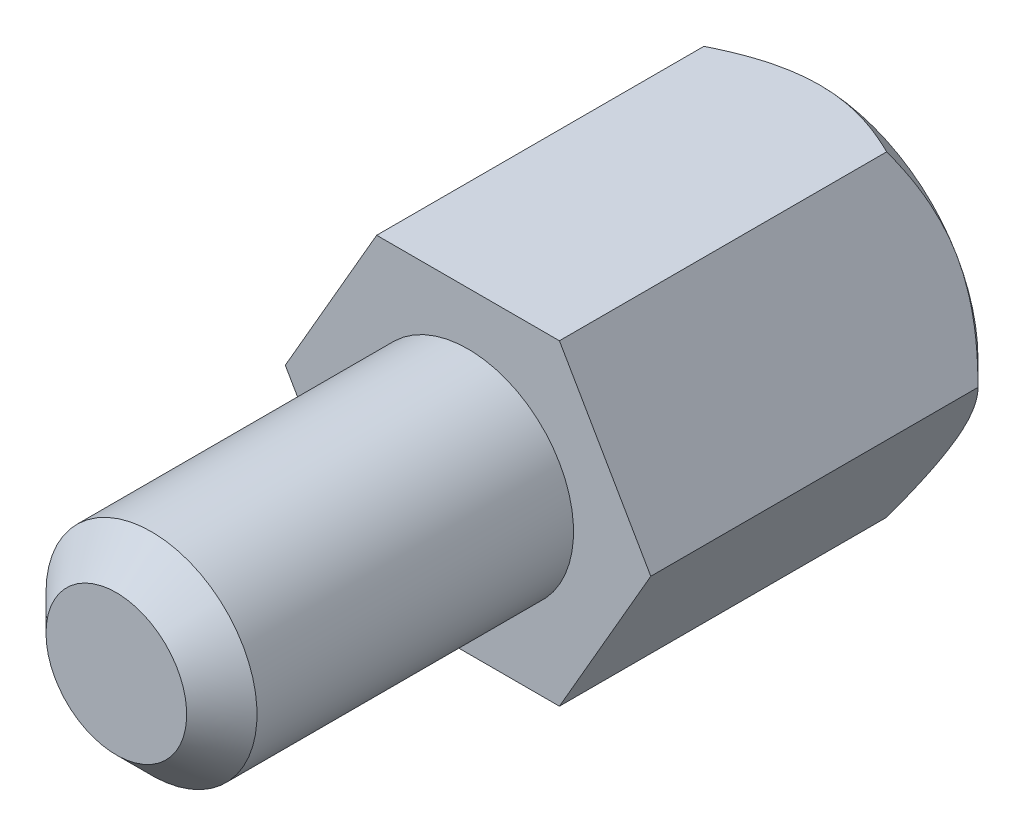
ISO-10303-21;
HEADER;
FILE_DESCRIPTION(('STEP AP214'),'2;1');
FILE_NAME('part.step','',(''),(''),'','','');
FILE_SCHEMA(('AUTOMOTIVE_DESIGN { 1 0 10303 214 1 1 1 1 }'));
ENDSEC;
DATA;
#1=APPLICATION_CONTEXT('core data for automotive mechanical design processes');
#2=APPLICATION_PROTOCOL_DEFINITION('international standard','automotive_design',2000,#1);
#3=PRODUCT_CONTEXT('',#1,'mechanical');
#4=PRODUCT('Part','Part','',(#3));
#5=PRODUCT_RELATED_PRODUCT_CATEGORY('part','',(#4));
#6=PRODUCT_DEFINITION_FORMATION('','',#4);
#7=PRODUCT_DEFINITION_CONTEXT('part definition',#1,'design');
#8=PRODUCT_DEFINITION('design','',#6,#7);
#9=PRODUCT_DEFINITION_SHAPE('','',#8);
#10=(LENGTH_UNIT() NAMED_UNIT(*) SI_UNIT(.MILLI.,.METRE.));
#11=(NAMED_UNIT(*) PLANE_ANGLE_UNIT() SI_UNIT($,.RADIAN.));
#12=(NAMED_UNIT(*) SI_UNIT($,.STERADIAN.) SOLID_ANGLE_UNIT());
#13=UNCERTAINTY_MEASURE_WITH_UNIT(LENGTH_MEASURE(1.E-05),#10,'distance_accuracy_value','');
#14=(GEOMETRIC_REPRESENTATION_CONTEXT(3) GLOBAL_UNCERTAINTY_ASSIGNED_CONTEXT((#13)) GLOBAL_UNIT_ASSIGNED_CONTEXT((#10,
#11,#12)) REPRESENTATION_CONTEXT('',''));
#15=CARTESIAN_POINT('',(0.,0.,0.));
#16=DIRECTION('',(0.,0.,1.));
#17=DIRECTION('',(1.,0.,0.));
#18=AXIS2_PLACEMENT_3D('',#15,#16,#17);
#19=CARTESIAN_POINT('',(0.,0.,-1.));
#20=DIRECTION('',(0.,0.,-1.));
#21=DIRECTION('',(-1.,0.,0.));
#22=AXIS2_PLACEMENT_3D('',#19,#20,#21);
#23=PLANE('',#22);
#24=CARTESIAN_POINT('',(0.,0.,-1.));
#25=DIRECTION('',(0.,0.,-1.));
#26=DIRECTION('',(-1.,0.,0.));
#27=AXIS2_PLACEMENT_3D('',#24,#25,#26);
#28=CIRCLE('',#27,1.2);
#29=CARTESIAN_POINT('',(-1.2,0.,-1.));
#30=VERTEX_POINT('',#29);
#31=EDGE_CURVE('E20',#30,#30,#28,.T.);
#32=ORIENTED_EDGE('',*,*,#31,.T.);
#33=EDGE_LOOP('',(#32));
#34=FACE_BOUND('',#33,.T.);
#35=ADVANCED_FACE('F17',(#34),#23,.T.);
#36=CARTESIAN_POINT('',(0.,0.,-1.));
#37=DIRECTION('',(0.,0.,-1.));
#38=DIRECTION('',(-1.,0.,0.));
#39=AXIS2_PLACEMENT_3D('',#36,#37,#38);
#40=CYLINDRICAL_SURFACE('',#39,1.2);
#41=CARTESIAN_POINT('',(0.,0.,-4.50000000006412));
#42=DIRECTION('',(0.,0.,-1.));
#43=DIRECTION('',(-1.,0.,0.));
#44=AXIS2_PLACEMENT_3D('',#41,#42,#43);
#45=CIRCLE('',#44,1.19999999998299);
#46=CARTESIAN_POINT('',(-1.19999999998299,0.,-4.50000000006412));
#47=VERTEX_POINT('',#46);
#48=EDGE_CURVE('E98',#47,#47,#45,.T.);
#49=ORIENTED_EDGE('',*,*,#48,.T.);
#50=EDGE_LOOP('',(#49));
#51=FACE_BOUND('',#50,.T.);
#52=ORIENTED_EDGE('',*,*,#31,.F.);
#53=EDGE_LOOP('',(#52));
#54=FACE_BOUND('',#53,.T.);
#55=ADVANCED_FACE('F139',(#51,#54),#40,.F.);
#56=CARTESIAN_POINT('',(0.,0.,-4.99999999999545));
#57=DIRECTION('',(0.,0.,-1.));
#58=DIRECTION('',(-1.,0.,0.));
#59=AXIS2_PLACEMENT_3D('',#56,#57,#58);
#60=CONICAL_SURFACE('',#59,1.69999999991433,0.785398163340605);
#61=CARTESIAN_POINT('',(0.,0.,-5.0000000000523));
#62=DIRECTION('',(0.,0.,-1.));
#63=DIRECTION('',(-1.,0.,0.));
#64=AXIS2_PLACEMENT_3D('',#61,#62,#63);
#65=CIRCLE('',#64,1.69999999997117);
#66=CARTESIAN_POINT('',(-1.69999999997117,0.,-5.0000000000523));
#67=VERTEX_POINT('',#66);
#68=EDGE_CURVE('E210',#67,#67,#65,.T.);
#69=ORIENTED_EDGE('',*,*,#68,.T.);
#70=EDGE_LOOP('',(#69));
#71=FACE_BOUND('',#70,.T.);
#72=ORIENTED_EDGE('',*,*,#48,.F.);
#73=EDGE_LOOP('',(#72));
#74=FACE_BOUND('',#73,.T.);
#75=ADVANCED_FACE('F134',(#71,#74),#60,.F.);
#76=CARTESIAN_POINT('',(0.,0.,-4.64983533146324));
#77=DIRECTION('',(0.,0.,1.));
#78=DIRECTION('',(1.,0.,0.));
#79=AXIS2_PLACEMENT_3D('',#76,#77,#78);
#80=CONICAL_SURFACE('',#79,2.60016466853585,0.785398163478615);
#81=CARTESIAN_POINT('',(0.,0.,-4.99999999993861));
#82=DIRECTION('',(0.,0.,1.));
#83=DIRECTION('',(1.,0.,0.));
#84=AXIS2_PLACEMENT_3D('',#81,#82,#83);
#85=CIRCLE('',#84,2.25000000000364);
#86=CARTESIAN_POINT('',(1.94855715851657,1.12500000000091,-4.99999999994043));
#87=VERTEX_POINT('',#86);
#88=CARTESIAN_POINT('',(0.,2.25000000000182,-4.99999999994043));
#89=VERTEX_POINT('',#88);
#90=EDGE_CURVE('E107',#87,#89,#85,.T.);
#91=ORIENTED_EDGE('',*,*,#90,.T.);
#92=CARTESIAN_POINT('',(0.,2.25,-4.99999999994225));
#93=CARTESIAN_POINT('',(0.0691231952969481,2.25,-5.00005769566472));
#94=CARTESIAN_POINT('',(0.138210834061678,2.25,-4.99681595840725));
#95=CARTESIAN_POINT('',(0.275703192085911,2.25,-4.9841880738306));
#96=CARTESIAN_POINT('',(0.344108913998066,2.25,-4.97481295788263));
#97=CARTESIAN_POINT('',(0.478853281082809,2.25,-4.95055410759525));
#98=CARTESIAN_POINT('',(0.545207541880582,2.25,-4.93575558561657));
#99=CARTESIAN_POINT('',(0.676649632414394,2.25,-4.90131240170121));
#100=CARTESIAN_POINT('',(0.741737058618174,2.25,-4.88166622201075));
#101=CARTESIAN_POINT('',(0.890255506277357,2.25,-4.83157588954895));
#102=CARTESIAN_POINT('',(0.973191975157517,2.25,-4.7996679034908));
#103=CARTESIAN_POINT('',(1.09619890484288,2.25,-4.74745032324661));
#104=CARTESIAN_POINT('',(1.13717470612179,2.25,-4.72921361446463));
#105=CARTESIAN_POINT('',(1.21853808880119,2.25,-4.69147710460049));
#106=CARTESIAN_POINT('',(1.25892570915799,2.25,-4.67197738764001));
#107=CARTESIAN_POINT('',(1.29903811794718,2.25,-4.65192378251017));
#108=B_SPLINE_CURVE_WITH_KNOTS('',3,(#92,#93,#94,#95,#96,#97,#98,#99,#100,#101,#102,#103,#104,
#105,#106,#107),.UNSPECIFIED.,.F.,.F.,(4,2,2,2,2,2,2,4),(0.,0.207236750061439,0.414101789224245,
0.617846930899487,0.821655944289508,1.08795515504436,1.22249175677334,1.35701940699246),.UNSPECIFIED.);
#109=CARTESIAN_POINT('',(1.29903812335872,2.24999996937378,-4.65192380632749));
#110=VERTEX_POINT('',#109);
#111=EDGE_CURVE('E97',#89,#110,#108,.T.);
#112=ORIENTED_EDGE('',*,*,#111,.T.);
#113=CARTESIAN_POINT('',(1.29903814104078,2.24999993874756,-4.65192382400954));
#114=CARTESIAN_POINT('',(1.34397176096636,2.17217262606846,-4.69681511428304));
#115=CARTESIAN_POINT('',(1.38966481639771,2.09302993250831,-4.73905431559381));
#116=CARTESIAN_POINT('',(1.48287268880467,1.93158916183404,-4.81634968521076));
#117=CARTESIAN_POINT('',(1.530397249423,1.84927420823571,-4.85135842660177));
#118=CARTESIAN_POINT('',(1.62559553404947,1.68438594246927,-4.91081128891958));
#119=CARTESIAN_POINT('',(1.67322478044966,1.60188966777792,-4.93553288038567));
#120=CARTESIAN_POINT('',(1.76950500984404,1.43512741870246,-4.97362178793472));
#121=CARTESIAN_POINT('',(1.8181523999549,1.35086766737483,-4.98702379044215));
#122=CARTESIAN_POINT('',(1.88054136312167,1.24280681333844,-4.99605556502801));
#123=CARTESIAN_POINT('',(1.8941010871739,1.21932068234337,-4.99752952614255));
#124=CARTESIAN_POINT('',(1.9212920183797,1.17222460798982,-4.99950329210802));
#125=CARTESIAN_POINT('',(1.93492329593189,1.14861454269735,-4.99999921519013));
#126=CARTESIAN_POINT('',(1.94855715851499,1.125,-4.99999999994224));
#127=B_SPLINE_CURVE_WITH_KNOTS('',3,(#113,#114,#115,#116,#117,#118,#119,#120,#121,#122,#123,
#124,#125,#126),.UNSPECIFIED.,.F.,.F.,(4,2,2,2,2,2,4),(0.,0.301589252505211,0.605097951221235,
0.899785727268252,1.19356718620256,1.27503294851359,1.35682139754623),.UNSPECIFIED.);
#128=EDGE_CURVE('E85',#110,#87,#127,.T.);
#129=ORIENTED_EDGE('',*,*,#128,.T.);
#130=EDGE_LOOP('',(#91,#112,#129));
#131=FACE_BOUND('',#130,.T.);
#132=ADVANCED_FACE('F106',(#131),#80,.T.);
#133=CARTESIAN_POINT('',(0.,0.,-4.64983533146324));
#134=DIRECTION('',(0.,0.,1.));
#135=DIRECTION('',(1.,0.,0.));
#136=AXIS2_PLACEMENT_3D('',#133,#134,#135);
#137=CONICAL_SURFACE('',#136,2.60016466853585,0.785398163478615);
#138=CARTESIAN_POINT('',(-1.94855715851498,1.125,-4.99999999994225));
#139=CARTESIAN_POINT('',(-1.91399556087554,1.18486244310227,-5.00005769566468));
#140=CARTESIAN_POINT('',(-1.8794517415021,1.24469409334456,-4.99681595840892));
#141=CARTESIAN_POINT('',(-1.81070556250572,1.3637659681925,-4.9841880738384));
#142=CARTESIAN_POINT('',(-1.77650270155648,1.42300706112081,-4.97481295789452));
#143=CARTESIAN_POINT('',(-1.70913051801204,1.53969910603662,-4.95055410761177));
#144=CARTESIAN_POINT('',(-1.6759533876045,1.59716358155183,-4.93575558563104));
#145=CARTESIAN_POINT('',(-1.61023234232141,1.71099577110868,-4.9013124017095));
#146=CARTESIAN_POINT('',(-1.57768862921196,1.76736313568119,-4.88166622201515));
#147=CARTESIAN_POINT('',(-1.50342941262247,1.89598387174444,-4.83157589443633));
#148=CARTESIAN_POINT('',(-1.46196118522524,1.96780894849627,-4.79966791448344));
#149=CARTESIAN_POINT('',(-1.40045773071639,2.0743360565466,-4.74745034472723));
#150=CARTESIAN_POINT('',(-1.3799698335219,2.1098221354277,-4.72921363970782));
#151=CARTESIAN_POINT('',(-1.33928814897233,2.18028488000504,-4.69147713772548));
#152=CARTESIAN_POINT('',(-1.31909434213916,2.21526157943832,-4.67197742488395));
#153=CARTESIAN_POINT('',(-1.2990381410479,2.24999993873521,-4.65192382401668));
#154=B_SPLINE_CURVE_WITH_KNOTS('',3,(#138,#139,#140,#141,#142,#143,#144,#145,#146,#147,#148,
#149,#150,#151,#152,#153),.UNSPECIFIED.,.F.,.F.,(4,2,2,2,2,2,2,4),(0.,0.207236750007737,
0.414101789128227,0.617846930856227,0.821655944289529,1.08795510917792,1.22249168743843,
1.35701931421665),.UNSPECIFIED.);
#155=CARTESIAN_POINT('',(-1.94855715851656,1.12500000000091,-4.99999999994043));
#156=VERTEX_POINT('',#155);
#157=CARTESIAN_POINT('',(-1.29903811275409,2.25,-4.65192378510672));
#158=VERTEX_POINT('',#157);
#159=EDGE_CURVE('E109',#156,#158,#154,.T.);
#160=ORIENTED_EDGE('',*,*,#159,.T.);
#161=CARTESIAN_POINT('',(-1.29903811311482,2.24999996936861,-4.65192376813459));
#162=CARTESIAN_POINT('',(-1.20917087313892,2.24999998898255,-4.69681507139159));
#163=CARTESIAN_POINT('',(-1.11778475968825,2.24999999704264,-4.73905428051075));
#164=CARTESIAN_POINT('',(-0.931369007384038,2.25000000297619,-4.81634966086851));
#165=CARTESIAN_POINT('',(-0.836319881233159,2.25000000078449,-4.85135840516906));
#166=CARTESIAN_POINT('',(-0.645923302935002,2.24999999923831,-4.91081127374393));
#167=CARTESIAN_POINT('',(-0.550664806013649,2.24999999980322,-4.93553286858432));
#168=CARTESIAN_POINT('',(-0.358104338417895,2.25000000019618,-4.97362178173023));
#169=CARTESIAN_POINT('',(-0.260809553511088,2.25000000002649,-4.98702378646013));
#170=CARTESIAN_POINT('',(-0.136031617176851,2.24999999999266,-4.99605556349461));
#171=CARTESIAN_POINT('',(-0.108912163840652,2.24999999999632,-4.9975295251809));
#172=CARTESIAN_POINT('',(-0.0545302908898665,2.2500000000037,-4.99950329191626));
#173=CARTESIAN_POINT('',(-0.0272677304779138,2.25000000000741,-4.99999921519376));
#174=CARTESIAN_POINT('',(0.,2.25,-4.99999999994225));
#175=B_SPLINE_CURVE_WITH_KNOTS('',3,(#161,#162,#163,#164,#165,#166,#167,#168,#169,#170,#171,
#172,#173,#174),.UNSPECIFIED.,.F.,.F.,(4,2,2,2,2,2,4),(0.,0.301589269313151,0.605097984614075,
0.899785775270863,1.19356724886461,1.27503302693426,1.35682149189123),.UNSPECIFIED.);
#176=EDGE_CURVE('E112',#158,#89,#175,.T.);
#177=ORIENTED_EDGE('',*,*,#176,.T.);
#178=CARTESIAN_POINT('',(0.,0.,-4.99999999993861));
#179=DIRECTION('',(0.,0.,1.));
#180=DIRECTION('',(1.,0.,0.));
#181=AXIS2_PLACEMENT_3D('',#178,#179,#180);
#182=CIRCLE('',#181,2.25000000000364);
#183=EDGE_CURVE('E283',#89,#156,#182,.T.);
#184=ORIENTED_EDGE('',*,*,#183,.T.);
#185=EDGE_LOOP('',(#160,#177,#184));
#186=FACE_BOUND('',#185,.T.);
#187=ADVANCED_FACE('F133',(#186),#137,.T.);
#188=CARTESIAN_POINT('',(0.,0.,-4.64983533146324));
#189=DIRECTION('',(0.,0.,1.));
#190=DIRECTION('',(1.,0.,0.));
#191=AXIS2_PLACEMENT_3D('',#188,#189,#190);
#192=CONICAL_SURFACE('',#191,2.60016466853585,0.785398163478615);
#193=CARTESIAN_POINT('',(-1.94855715851498,-1.125,-4.99999999994225));
#194=CARTESIAN_POINT('',(-1.98311875615442,-1.06513755689773,-5.00005769566469));
#195=CARTESIAN_POINT('',(-2.01766257552787,-1.00530590665544,-4.99681595840892));
#196=CARTESIAN_POINT('',(-2.08640875452424,-0.886234031807498,-4.98418807383841));
#197=CARTESIAN_POINT('',(-2.12061161547349,-0.826992938879196,-4.97481295789453));
#198=CARTESIAN_POINT('',(-2.18798379901792,-0.710300893963381,-4.95055410761178));
#199=CARTESIAN_POINT('',(-2.22116092942547,-0.652836418448172,-4.93575558563105));
#200=CARTESIAN_POINT('',(-2.28688197470856,-0.539004228891321,-4.90131240170951));
#201=CARTESIAN_POINT('',(-2.319425687818,-0.482636864318816,-4.88166622201516));
#202=CARTESIAN_POINT('',(-2.39368490440745,-0.354016128255625,-4.83157589443636));
#203=CARTESIAN_POINT('',(-2.43515313180466,-0.282191051503849,-4.79966791448349));
#204=CARTESIAN_POINT('',(-2.49665658631346,-0.175663943453599,-4.74745034472733));
#205=CARTESIAN_POINT('',(-2.51714448350794,-0.140177864572523,-4.72921363970795));
#206=CARTESIAN_POINT('',(-2.55782616805747,-0.0697151199952434,-4.69147713772564));
#207=CARTESIAN_POINT('',(-2.57801997489062,-0.034738420561985,-4.67197742488413));
#208=CARTESIAN_POINT('',(-2.59807617598187,-6.12651227535217E-08,-4.65192382401688));
#209=B_SPLINE_CURVE_WITH_KNOTS('',3,(#193,#194,#195,#196,#197,#198,#199,#200,#201,#202,#203,
#204,#205,#206,#207,#208),.UNSPECIFIED.,.F.,.F.,(4,2,2,2,2,2,2,4),(0.,0.207236750007735,
0.414101789128224,0.617846930856223,0.821655944289525,1.0879551091777,1.2224916874381,
1.35701931421622),.UNSPECIFIED.);
#210=CARTESIAN_POINT('',(-1.94855715851656,-1.12500000000091,-4.99999999994043));
#211=VERTEX_POINT('',#210);
#212=CARTESIAN_POINT('',(-2.59807621489213,-6.12940751478169E-09,-4.65192378510662));
#213=VERTEX_POINT('',#212);
#214=EDGE_CURVE('E179',#211,#213,#209,.T.);
#215=ORIENTED_EDGE('',*,*,#214,.T.);
#216=CARTESIAN_POINT('',(-2.59807618854488,-2.17577171721221E-08,-4.65192376813433));
#217=CARTESIAN_POINT('',(-2.55314258554319,0.0778273008364195,-4.6968150713914));
#218=CARTESIAN_POINT('',(-2.50744953579812,0.156970000667897,-4.73905428051059));
#219=CARTESIAN_POINT('',(-2.41424166478463,0.318410780795755,-4.81634966086841));
#220=CARTESIAN_POINT('',(-2.3667170998111,0.400725737554094,-4.85135840516896));
#221=CARTESIAN_POINT('',(-2.27151880932296,0.565614010380873,-4.91081127374386));
#222=CARTESIAN_POINT('',(-2.22388956135151,0.648110288923558,-4.93553286858427));
#223=CARTESIAN_POINT('',(-2.12760932789392,0.814872545822607,-4.97362178173021));
#224=CARTESIAN_POINT('',(-2.07896193529356,0.89913230112282,-4.98702378646011));
#225=CARTESIAN_POINT('',(-2.01657296709711,1.00719316380319,-4.99605556349461));
#226=CARTESIAN_POINT('',(-2.00301324043217,1.03067929933094,-4.9975295251809));
#227=CARTESIAN_POINT('',(-1.97582230396314,1.07777538281543,-4.99950329191626));
#228=CARTESIAN_POINT('',(-1.96219102376037,1.10138545270626,-4.99999921519377));
#229=CARTESIAN_POINT('',(-1.94855715851498,1.125,-4.99999999994225));
#230=B_SPLINE_CURVE_WITH_KNOTS('',3,(#216,#217,#218,#219,#220,#221,#222,#223,#224,#225,#226,
#227,#228,#229),.UNSPECIFIED.,.F.,.F.,(4,2,2,2,2,2,4),(0.,0.301589269313229,0.605097984614229,
0.899785775271084,1.1935672488649,1.27503302693462,1.35682149189166),.UNSPECIFIED.);
#231=EDGE_CURVE('E171',#213,#156,#230,.T.);
#232=ORIENTED_EDGE('',*,*,#231,.T.);
#233=CARTESIAN_POINT('',(0.,0.,-4.99999999993861));
#234=DIRECTION('',(0.,0.,1.));
#235=DIRECTION('',(1.,0.,0.));
#236=AXIS2_PLACEMENT_3D('',#233,#234,#235);
#237=CIRCLE('',#236,2.25000000000364);
#238=EDGE_CURVE('E278',#156,#211,#237,.T.);
#239=ORIENTED_EDGE('',*,*,#238,.T.);
#240=EDGE_LOOP('',(#215,#232,#239));
#241=FACE_BOUND('',#240,.T.);
#242=ADVANCED_FACE('F190',(#241),#192,.T.);
#243=CARTESIAN_POINT('',(0.,0.,-4.64983533146324));
#244=DIRECTION('',(0.,0.,1.));
#245=DIRECTION('',(1.,0.,0.));
#246=AXIS2_PLACEMENT_3D('',#243,#244,#245);
#247=CONICAL_SURFACE('',#246,2.60016466853585,0.785398163478615);
#248=CARTESIAN_POINT('',(0.,0.,-4.99999999993861));
#249=DIRECTION('',(0.,0.,1.));
#250=DIRECTION('',(1.,0.,0.));
#251=AXIS2_PLACEMENT_3D('',#248,#249,#250);
#252=CIRCLE('',#251,2.25000000000364);
#253=CARTESIAN_POINT('',(0.,-2.25000000000182,-4.99999999994043));
#254=VERTEX_POINT('',#253);
#255=CARTESIAN_POINT('',(1.94855715851656,-1.12500000000091,-4.99999999994043));
#256=VERTEX_POINT('',#255);
#257=EDGE_CURVE('E282',#254,#256,#252,.T.);
#258=ORIENTED_EDGE('',*,*,#257,.T.);
#259=CARTESIAN_POINT('',(1.94855715851499,-1.125,-4.99999999994225));
#260=CARTESIAN_POINT('',(1.91399556086651,-1.18486244311791,-5.00005769566472));
#261=CARTESIAN_POINT('',(1.87945174148415,-1.24469409337565,-4.99681595840725));
#262=CARTESIAN_POINT('',(1.81070556247203,-1.36376596825087,-4.9841880738306));
#263=CARTESIAN_POINT('',(1.77650270151595,-1.42300706119101,-4.97481295788263));
#264=CARTESIAN_POINT('',(1.70913051797358,-1.53969910610325,-4.95055410759525));
#265=CARTESIAN_POINT('',(1.67595338757469,-1.59716358160346,-4.93575558561657));
#266=CARTESIAN_POINT('',(1.61023234230779,-1.71099577113227,-4.90131240170121));
#267=CARTESIAN_POINT('',(1.5776886292059,-1.76736313569168,-4.88166622201075));
#268=CARTESIAN_POINT('',(1.503429405375,-1.89598388429743,-4.83157588954807));
#269=CARTESIAN_POINT('',(1.46196117093365,-1.96780897325004,-4.79966790348882));
#270=CARTESIAN_POINT('',(1.4004577060891,-2.07433609920232,-4.74745032324273));
#271=CARTESIAN_POINT('',(1.37996980544901,-2.10982218405137,-4.72921361446007));
#272=CARTESIAN_POINT('',(1.33928811410809,-2.18028494039168,-4.69147710459451));
#273=CARTESIAN_POINT('',(1.31909430392908,-2.21526164562012,-4.67197738763328));
#274=CARTESIAN_POINT('',(1.29903809953389,-2.25000001063958,-4.65192378250267));
#275=B_SPLINE_CURVE_WITH_KNOTS('',3,(#259,#260,#261,#262,#263,#264,#265,#266,#267,#268,#269,
#270,#271,#272,#273,#274),.UNSPECIFIED.,.F.,.F.,(4,2,2,2,2,2,2,4),(0.,0.207236750061449,
0.414101789224262,0.617846930899494,0.821655944289507,1.08795515505265,1.22249175678588,
1.35701940700924),.UNSPECIFIED.);
#276=CARTESIAN_POINT('',(1.29903807030487,-2.25,-4.65192380633133));
#277=VERTEX_POINT('',#276);
#278=EDGE_CURVE('E203',#256,#277,#275,.T.);
#279=ORIENTED_EDGE('',*,*,#278,.T.);
#280=CARTESIAN_POINT('',(1.29903803493308,-2.25,-4.65192382401723));
#281=CARTESIAN_POINT('',(1.20917079508285,-2.25,-4.69681511428986));
#282=CARTESIAN_POINT('',(1.11778468422112,-2.25,-4.73905431559979));
#283=CARTESIAN_POINT('',(0.931368939409197,-2.25,-4.81634968521512));
#284=CARTESIAN_POINT('',(0.836319818173591,-2.25,-4.85135842660536));
#285=CARTESIAN_POINT('',(0.645923248922773,-2.25,-4.91081128892184));
#286=CARTESIAN_POINT('',(0.550664756123445,-2.25,-4.93553288038735));
#287=CARTESIAN_POINT('',(0.358104297336863,-2.25,-4.97362178793548));
#288=CARTESIAN_POINT('',(0.260809517116269,-2.25,-4.98702379044256));
#289=CARTESIAN_POINT('',(0.136031590784321,-2.25,-4.99605556502816));
#290=CARTESIAN_POINT('',(0.108912142680328,-2.25,-4.99752952614264));
#291=CARTESIAN_POINT('',(0.0545302802696619,-2.25,-4.99950329210805));
#292=CARTESIAN_POINT('',(0.0272677251657489,-2.25,-4.99999921519013));
#293=CARTESIAN_POINT('',(0.,-2.25,-4.99999999994225));
#294=B_SPLINE_CURVE_WITH_KNOTS('',3,(#280,#281,#282,#283,#284,#285,#286,#287,#288,#289,#290,
#291,#292,#293),.UNSPECIFIED.,.F.,.F.,(4,2,2,2,2,2,4),(0.,0.301589252501537,0.605097951213804,
0.899785727257333,1.19356718618819,1.27503294849784,1.35682139752908),.UNSPECIFIED.);
#295=EDGE_CURVE('E178',#277,#254,#294,.T.);
#296=ORIENTED_EDGE('',*,*,#295,.T.);
#297=EDGE_LOOP('',(#258,#279,#296));
#298=FACE_BOUND('',#297,.T.);
#299=ADVANCED_FACE('F193',(#298),#247,.T.);
#300=CARTESIAN_POINT('',(-1.29903810567665,-2.25,-5.));
#301=DIRECTION('',(0.,0.,1.));
#302=DIRECTION('',(1.,0.,0.));
#303=AXIS2_PLACEMENT_3D('',#300,#301,#302);
#304=PLANE('',#303);
#305=CARTESIAN_POINT('',(0.,0.,-4.99999999993861));
#306=DIRECTION('',(0.,0.,1.));
#307=DIRECTION('',(1.,0.,0.));
#308=AXIS2_PLACEMENT_3D('',#305,#306,#307);
#309=CIRCLE('',#308,2.25000000000364);
#310=EDGE_CURVE('E290',#256,#87,#309,.T.);
#311=ORIENTED_EDGE('',*,*,#310,.F.);
#312=ORIENTED_EDGE('',*,*,#257,.F.);
#313=CARTESIAN_POINT('',(0.,0.,-4.99999999993861));
#314=DIRECTION('',(0.,0.,1.));
#315=DIRECTION('',(1.,0.,0.));
#316=AXIS2_PLACEMENT_3D('',#313,#314,#315);
#317=CIRCLE('',#316,2.25000000000364);
#318=EDGE_CURVE('E258',#211,#254,#317,.T.);
#319=ORIENTED_EDGE('',*,*,#318,.F.);
#320=ORIENTED_EDGE('',*,*,#238,.F.);
#321=ORIENTED_EDGE('',*,*,#183,.F.);
#322=ORIENTED_EDGE('',*,*,#90,.F.);
#323=EDGE_LOOP('',(#311,#312,#319,#320,#321,#322));
#324=FACE_BOUND('',#323,.T.);
#325=ORIENTED_EDGE('',*,*,#68,.F.);
#326=EDGE_LOOP('',(#325));
#327=FACE_BOUND('',#326,.T.);
#328=ADVANCED_FACE('F199',(#324,#327),#304,.F.);
#329=CARTESIAN_POINT('',(0.,0.,-4.64983533146324));
#330=DIRECTION('',(0.,0.,1.));
#331=DIRECTION('',(1.,0.,0.));
#332=AXIS2_PLACEMENT_3D('',#329,#330,#331);
#333=CONICAL_SURFACE('',#332,2.60016466853585,0.785398163478615);
#334=CARTESIAN_POINT('',(0.,-2.25,-4.99999999994225));
#335=CARTESIAN_POINT('',(-0.0691231952942782,-2.25,-5.00005769566472));
#336=CARTESIAN_POINT('',(-0.13821083405637,-2.25,-4.9968159584075));
#337=CARTESIAN_POINT('',(-0.275703192075949,-2.25,-4.98418807383176));
#338=CARTESIAN_POINT('',(-0.344108913986084,-2.25,-4.97481295788439));
#339=CARTESIAN_POINT('',(-0.478853281071437,-2.25,-4.95055410759769));
#340=CARTESIAN_POINT('',(-0.545207541871771,-2.25,-4.93575558561871));
#341=CARTESIAN_POINT('',(-0.676649632410368,-2.25,-4.90131240170244));
#342=CARTESIAN_POINT('',(-0.741737058616381,-2.25,-4.8816662220114));
#343=CARTESIAN_POINT('',(-0.890255504135093,-2.25,-4.83157589027141));
#344=CARTESIAN_POINT('',(-0.973191970933099,-2.25,-4.79966790511574));
#345=CARTESIAN_POINT('',(-1.09619889756336,-2.25,-4.74745032642189));
#346=CARTESIAN_POINT('',(-1.1371746978238,-2.25,-4.7292136181961));
#347=CARTESIAN_POINT('',(-1.21853807849575,-2.25,-4.69147710949705));
#348=CARTESIAN_POINT('',(-1.25892569786357,-2.25,-4.67197739314543));
#349=CARTESIAN_POINT('',(-1.29903810567615,-2.25,-4.65192378864569));
#350=B_SPLINE_CURVE_WITH_KNOTS('',3,(#334,#335,#336,#337,#338,#339,#340,#341,#342,#343,#344,
#345,#346,#347,#348,#349),.UNSPECIFIED.,.F.,.F.,(4,2,2,2,2,2,2,4),(0.,0.207236750053501,
0.414101789210051,0.617846930893092,0.82165594428951,1.08795514826436,1.22249174652422,
1.3570193932783),.UNSPECIFIED.);
#351=CARTESIAN_POINT('',(-1.29903810567653,-2.24999999999978,-4.65192378864569));
#352=VERTEX_POINT('',#351);
#353=EDGE_CURVE('E235',#254,#352,#350,.T.);
#354=ORIENTED_EDGE('',*,*,#353,.T.);
#355=CARTESIAN_POINT('',(-1.2990381056769,-2.24999999999957,-4.65192378864569));
#356=CARTESIAN_POINT('',(-1.34397172775764,-2.17217268358763,-4.69681508289023));
#357=CARTESIAN_POINT('',(-1.38966478540272,-2.09302998619318,-4.73905428810587));
#358=CARTESIAN_POINT('',(-1.48287266245123,-1.93158920747953,-4.81634966516579));
#359=CARTESIAN_POINT('',(-1.53039722549975,-1.84927424967197,-4.85135841008544));
#360=CARTESIAN_POINT('',(-1.62559551499861,-1.68438597546631,-4.91081127854707));
#361=CARTESIAN_POINT('',(-1.67322476383148,-1.60188969656144,-4.93553287267273));
#362=CARTESIAN_POINT('',(-1.76950499824655,-1.43512743878989,-4.97362178447698));
#363=CARTESIAN_POINT('',(-1.81815239094441,-1.35086768298144,-4.98702378858758));
#364=CARTESIAN_POINT('',(-1.88054135779069,-1.24280682257195,-4.99605556441006));
#365=CARTESIAN_POINT('',(-1.89410108290061,-1.2193206897449,-4.99752952575491));
#366=CARTESIAN_POINT('',(-1.9212920162358,-1.17222461170314,-4.99950329202985));
#367=CARTESIAN_POINT('',(-1.9349232948597,-1.14861454455441,-4.99999921519009));
#368=CARTESIAN_POINT('',(-1.94855715851498,-1.125,-4.99999999994225));
#369=B_SPLINE_CURVE_WITH_KNOTS('',3,(#355,#356,#357,#358,#359,#360,#361,#362,#363,#364,#365,
#366,#367,#368),.UNSPECIFIED.,.F.,.F.,(4,2,2,2,2,2,4),(0.,0.301589269436366,0.605097985463799,
0.899785777578431,1.19356725241796,1.27503302110004,1.35682147656287),.UNSPECIFIED.);
#370=EDGE_CURVE('E252',#352,#211,#369,.T.);
#371=ORIENTED_EDGE('',*,*,#370,.T.);
#372=ORIENTED_EDGE('',*,*,#318,.T.);
#373=EDGE_LOOP('',(#354,#371,#372));
#374=FACE_BOUND('',#373,.T.);
#375=ADVANCED_FACE('F245',(#374),#333,.T.);
#376=CARTESIAN_POINT('',(0.,0.,-4.64983533146324));
#377=DIRECTION('',(0.,0.,1.));
#378=DIRECTION('',(1.,0.,0.));
#379=AXIS2_PLACEMENT_3D('',#376,#377,#378);
#380=CONICAL_SURFACE('',#379,2.60016466853585,0.785398163478615);
#381=ORIENTED_EDGE('',*,*,#310,.T.);
#382=CARTESIAN_POINT('',(1.94855715851499,1.125,-4.99999999994224));
#383=CARTESIAN_POINT('',(1.98311875616213,1.0651375568844,-5.00005769566471));
#384=CARTESIAN_POINT('',(2.01766257554318,1.00530590662895,-4.99681595840749));
#385=CARTESIAN_POINT('',(2.08640875455296,0.886234031757776,-4.98418807383175));
#386=CARTESIAN_POINT('',(2.12061161550803,0.826992938819387,-4.97481295788438));
#387=CARTESIAN_POINT('',(2.18798379905071,0.710300893906615,-4.95055410759769));
#388=CARTESIAN_POINT('',(2.22116092945088,0.652836418404186,-4.93575558561871));
#389=CARTESIAN_POINT('',(2.28688197472018,0.539004228871222,-4.90131240170243));
#390=CARTESIAN_POINT('',(2.31942568782318,0.482636864309867,-4.8816662220114));
#391=CARTESIAN_POINT('',(2.39368491058139,0.354016117562086,-4.83157589027218));
#392=CARTESIAN_POINT('',(2.43515314397927,0.282191030416833,-4.79966790511748));
#393=CARTESIAN_POINT('',(2.49665660729275,0.175663907116434,-4.7474503264253));
#394=CARTESIAN_POINT('',(2.51714450742242,0.140177823151446,-4.72921361820011));
#395=CARTESIAN_POINT('',(2.55782619775731,0.0697150685536259,-4.69147710950232));
#396=CARTESIAN_POINT('',(2.57802000744069,0.0347383641836473,-4.67197739315136));
#397=CARTESIAN_POINT('',(2.59807621134645,1.1896807412358E-11,-4.6519237886523));
#398=B_SPLINE_CURVE_WITH_KNOTS('',3,(#382,#383,#384,#385,#386,#387,#388,#389,#390,#391,#392,
#393,#394,#395,#396,#397),.UNSPECIFIED.,.F.,.F.,(4,2,2,2,2,2,2,4),(0.,0.207236750053493,
0.414101789210038,0.617846930893087,0.821655944289513,1.08795514825705,1.22249174651317,
1.35701939326351),.UNSPECIFIED.);
#399=CARTESIAN_POINT('',(2.59807621138696,-5.7650610644841E-12,-4.65192378861196));
#400=VERTEX_POINT('',#399);
#401=EDGE_CURVE('E91',#87,#400,#398,.T.);
#402=ORIENTED_EDGE('',*,*,#401,.T.);
#403=CARTESIAN_POINT('',(2.59807621134001,-9.41665583510788E-12,-4.65192378864911));
#404=CARTESIAN_POINT('',(2.553142589264,-0.0778273164218923,-4.69681508289476));
#405=CARTESIAN_POINT('',(2.50744953162118,-0.156970013816018,-4.73905428811038));
#406=CARTESIAN_POINT('',(2.41424165457506,-0.318410792528162,-4.81634966516935));
#407=CARTESIAN_POINT('',(2.36671709152665,-0.400725750334542,-4.85135841008807));
#408=CARTESIAN_POINT('',(2.27151880202868,-0.565614024537989,-4.91081127854834));
#409=CARTESIAN_POINT('',(2.22388955319655,-0.648110303441829,-4.93553287267356));
#410=CARTESIAN_POINT('',(2.12760931878283,-0.814872561211215,-4.97362178447714));
#411=CARTESIAN_POINT('',(2.07896192608557,-0.899132317018547,-4.98702378858752));
#412=CARTESIAN_POINT('',(2.01657295923983,-1.00719317742709,-4.99605556440999));
#413=CARTESIAN_POINT('',(2.00301323412979,-1.03067931025434,-4.99752952575486));
#414=CARTESIAN_POINT('',(1.97582230079439,-1.07777538829648,-4.99950329202983));
#415=CARTESIAN_POINT('',(1.96219102217038,-1.1013854554454,-4.99999921519009));
#416=CARTESIAN_POINT('',(1.94855715851499,-1.125,-4.99999999994225));
#417=B_SPLINE_CURVE_WITH_KNOTS('',3,(#403,#404,#405,#406,#407,#408,#409,#410,#411,#412,#413,
#414,#415,#416),.UNSPECIFIED.,.F.,.F.,(4,2,2,2,2,2,4),(0.,0.301589269432515,0.605097985455878,
0.899785777566556,1.19356725240221,1.27503302108495,1.35682147654843),.UNSPECIFIED.);
#418=EDGE_CURVE('E221',#400,#256,#417,.T.);
#419=ORIENTED_EDGE('',*,*,#418,.T.);
#420=EDGE_LOOP('',(#381,#402,#419));
#421=FACE_BOUND('',#420,.T.);
#422=ADVANCED_FACE('F240',(#421),#380,.T.);
#423=CARTESIAN_POINT('',(0.,0.,5.));
#424=DIRECTION('',(0.,0.,1.));
#425=DIRECTION('',(1.,0.,0.));
#426=AXIS2_PLACEMENT_3D('',#423,#424,#425);
#427=PLANE('',#426);
#428=CARTESIAN_POINT('',(0.,0.,4.99999999999545));
#429=DIRECTION('',(0.,0.,-1.));
#430=DIRECTION('',(-1.,0.,0.));
#431=AXIS2_PLACEMENT_3D('',#428,#429,#430);
#432=CIRCLE('',#431,0.99999999991951);
#433=CARTESIAN_POINT('',(-0.99999999991951,0.,4.99999999999545));
#434=VERTEX_POINT('',#433);
#435=EDGE_CURVE('E312',#434,#434,#432,.T.);
#436=ORIENTED_EDGE('',*,*,#435,.F.);
#437=EDGE_LOOP('',(#436));
#438=FACE_BOUND('',#437,.T.);
#439=ADVANCED_FACE('F244',(#438),#427,.T.);
#440=CARTESIAN_POINT('',(-1.29903810567665,-2.25,-5.));
#441=DIRECTION('',(0.866025403784439,0.5,0.));
#442=DIRECTION('',(-0.5,0.866025403784439,0.));
#443=AXIS2_PLACEMENT_3D('',#440,#441,#442);
#444=PLANE('',#443);
#445=ORIENTED_EDGE('',*,*,#214,.F.);
#446=ORIENTED_EDGE('',*,*,#370,.F.);
#447=DIRECTION('',(0.,0.,1.));
#448=VECTOR('',#447,1.);
#449=CARTESIAN_POINT('',(-1.29903810567665,-2.25,-5.00000000000001));
#450=LINE('',#449,#448);
#451=CARTESIAN_POINT('',(-1.29903810567666,-2.25,0.));
#452=VERTEX_POINT('',#451);
#453=EDGE_CURVE('E230',#352,#452,#450,.T.);
#454=ORIENTED_EDGE('',*,*,#453,.T.);
#455=DIRECTION('',(0.499999999999998,-0.86602540378444,0.));
#456=VECTOR('',#455,1.);
#457=CARTESIAN_POINT('',(-2.59807621135331,0.,0.));
#458=LINE('',#457,#456);
#459=CARTESIAN_POINT('',(-2.59807621135331,0.,0.));
#460=VERTEX_POINT('',#459);
#461=EDGE_CURVE('E308',#460,#452,#458,.T.);
#462=ORIENTED_EDGE('',*,*,#461,.F.);
#463=DIRECTION('',(0.,0.,1.));
#464=VECTOR('',#463,1.);
#465=CARTESIAN_POINT('',(-2.59807621135331,0.,-5.));
#466=LINE('',#465,#464);
#467=EDGE_CURVE('E103',#460,#213,#466,.F.);
#468=ORIENTED_EDGE('',*,*,#467,.T.);
#469=EDGE_LOOP('',(#445,#446,#454,#462,#468));
#470=FACE_BOUND('',#469,.T.);
#471=ADVANCED_FACE('F260',(#470),#444,.F.);
#472=CARTESIAN_POINT('',(1.29903810567666,-2.25,-5.00000000000001));
#473=DIRECTION('',(0.,1.,0.));
#474=DIRECTION('',(-1.,0.,0.));
#475=AXIS2_PLACEMENT_3D('',#472,#473,#474);
#476=PLANE('',#475);
#477=ORIENTED_EDGE('',*,*,#353,.F.);
#478=ORIENTED_EDGE('',*,*,#295,.F.);
#479=DIRECTION('',(0.,0.,1.));
#480=VECTOR('',#479,1.);
#481=CARTESIAN_POINT('',(1.29903810567666,-2.25,-5.00000000000001));
#482=LINE('',#481,#480);
#483=CARTESIAN_POINT('',(1.29903810567666,-2.25,0.));
#484=VERTEX_POINT('',#483);
#485=EDGE_CURVE('E229',#277,#484,#482,.T.);
#486=ORIENTED_EDGE('',*,*,#485,.T.);
#487=DIRECTION('',(1.,0.,0.));
#488=VECTOR('',#487,1.);
#489=CARTESIAN_POINT('',(-1.29903810567666,-2.25,0.));
#490=LINE('',#489,#488);
#491=EDGE_CURVE('E311',#452,#484,#490,.T.);
#492=ORIENTED_EDGE('',*,*,#491,.F.);
#493=ORIENTED_EDGE('',*,*,#453,.F.);
#494=EDGE_LOOP('',(#477,#478,#486,#492,#493));
#495=FACE_BOUND('',#494,.T.);
#496=ADVANCED_FACE('F215',(#495),#476,.F.);
#497=CARTESIAN_POINT('',(2.59807621135331,0.,-5.00000000000001));
#498=DIRECTION('',(-0.866025403784439,0.5,0.));
#499=DIRECTION('',(-0.5,-0.866025403784439,0.));
#500=AXIS2_PLACEMENT_3D('',#497,#498,#499);
#501=PLANE('',#500);
#502=ORIENTED_EDGE('',*,*,#278,.F.);
#503=ORIENTED_EDGE('',*,*,#418,.F.);
#504=DIRECTION('',(0.,0.,1.));
#505=VECTOR('',#504,1.);
#506=CARTESIAN_POINT('',(2.59807621135332,0.,-5.00000000000001));
#507=LINE('',#506,#505);
#508=CARTESIAN_POINT('',(2.59807621135332,0.,0.));
#509=VERTEX_POINT('',#508);
#510=EDGE_CURVE('E104',#400,#509,#507,.T.);
#511=ORIENTED_EDGE('',*,*,#510,.T.);
#512=DIRECTION('',(0.499999999999998,0.86602540378444,0.));
#513=VECTOR('',#512,1.);
#514=CARTESIAN_POINT('',(1.29903810567666,-2.25,0.));
#515=LINE('',#514,#513);
#516=EDGE_CURVE('E316',#484,#509,#515,.T.);
#517=ORIENTED_EDGE('',*,*,#516,.F.);
#518=ORIENTED_EDGE('',*,*,#485,.F.);
#519=EDGE_LOOP('',(#502,#503,#511,#517,#518));
#520=FACE_BOUND('',#519,.T.);
#521=ADVANCED_FACE('F212',(#520),#501,.F.);
#522=CARTESIAN_POINT('',(1.29903810567666,2.25,-5.00000000000001));
#523=DIRECTION('',(-0.866025403784439,-0.5,0.));
#524=DIRECTION('',(0.5,-0.866025403784439,0.));
#525=AXIS2_PLACEMENT_3D('',#522,#523,#524);
#526=PLANE('',#525);
#527=ORIENTED_EDGE('',*,*,#401,.F.);
#528=ORIENTED_EDGE('',*,*,#128,.F.);
#529=DIRECTION('',(0.,0.,-1.));
#530=VECTOR('',#529,1.);
#531=CARTESIAN_POINT('',(1.29903810567666,2.25,-5.));
#532=LINE('',#531,#530);
#533=CARTESIAN_POINT('',(1.29903810567666,2.25,0.));
#534=VERTEX_POINT('',#533);
#535=EDGE_CURVE('E89',#110,#534,#532,.F.);
#536=ORIENTED_EDGE('',*,*,#535,.T.);
#537=DIRECTION('',(-0.499999999999998,0.86602540378444,0.));
#538=VECTOR('',#537,1.);
#539=CARTESIAN_POINT('',(2.59807621135331,0.,0.));
#540=LINE('',#539,#538);
#541=EDGE_CURVE('E305',#509,#534,#540,.T.);
#542=ORIENTED_EDGE('',*,*,#541,.F.);
#543=ORIENTED_EDGE('',*,*,#510,.F.);
#544=EDGE_LOOP('',(#527,#528,#536,#542,#543));
#545=FACE_BOUND('',#544,.T.);
#546=ADVANCED_FACE('F87',(#545),#526,.F.);
#547=CARTESIAN_POINT('',(-1.29903810567665,2.25,-5.));
#548=DIRECTION('',(0.,-1.,0.));
#549=DIRECTION('',(0.,0.,-1.));
#550=AXIS2_PLACEMENT_3D('',#547,#548,#549);
#551=PLANE('',#550);
#552=ORIENTED_EDGE('',*,*,#111,.F.);
#553=ORIENTED_EDGE('',*,*,#176,.F.);
#554=DIRECTION('',(0.,0.,1.));
#555=VECTOR('',#554,1.);
#556=CARTESIAN_POINT('',(-1.29903810567665,2.25,-5.));
#557=LINE('',#556,#555);
#558=CARTESIAN_POINT('',(-1.29903810567665,2.25,0.));
#559=VERTEX_POINT('',#558);
#560=EDGE_CURVE('E35',#158,#559,#557,.T.);
#561=ORIENTED_EDGE('',*,*,#560,.T.);
#562=DIRECTION('',(1.,0.,0.));
#563=VECTOR('',#562,1.);
#564=CARTESIAN_POINT('',(-1.29903810567666,2.25,0.));
#565=LINE('',#564,#563);
#566=EDGE_CURVE('E101',#534,#559,#565,.F.);
#567=ORIENTED_EDGE('',*,*,#566,.F.);
#568=ORIENTED_EDGE('',*,*,#535,.F.);
#569=EDGE_LOOP('',(#552,#553,#561,#567,#568));
#570=FACE_BOUND('',#569,.T.);
#571=ADVANCED_FACE('F99',(#570),#551,.F.);
#572=CARTESIAN_POINT('',(-2.59807621135331,0.,-5.));
#573=DIRECTION('',(0.866025403784439,-0.5,0.));
#574=DIRECTION('',(0.5,0.866025403784439,0.));
#575=AXIS2_PLACEMENT_3D('',#572,#573,#574);
#576=PLANE('',#575);
#577=ORIENTED_EDGE('',*,*,#159,.F.);
#578=ORIENTED_EDGE('',*,*,#231,.F.);
#579=ORIENTED_EDGE('',*,*,#467,.F.);
#580=DIRECTION('',(-0.500000000000001,-0.866025403784438,0.));
#581=VECTOR('',#580,1.);
#582=CARTESIAN_POINT('',(-1.29903810567665,2.25,0.));
#583=LINE('',#582,#581);
#584=EDGE_CURVE('E299',#559,#460,#583,.T.);
#585=ORIENTED_EDGE('',*,*,#584,.F.);
#586=ORIENTED_EDGE('',*,*,#560,.F.);
#587=EDGE_LOOP('',(#577,#578,#579,#585,#586));
#588=FACE_BOUND('',#587,.T.);
#589=ADVANCED_FACE('F164',(#588),#576,.F.);
#590=CARTESIAN_POINT('',(0.,0.,4.49999999995043));
#591=DIRECTION('',(0.,0.,-1.));
#592=DIRECTION('',(-1.,0.,0.));
#593=AXIS2_PLACEMENT_3D('',#590,#591,#592);
#594=CONICAL_SURFACE('',#593,1.50000000002137,0.785398163454292);
#595=CARTESIAN_POINT('',(0.,0.,4.5));
#596=DIRECTION('',(0.,0.,-1.));
#597=DIRECTION('',(-1.,0.,0.));
#598=AXIS2_PLACEMENT_3D('',#595,#596,#597);
#599=CIRCLE('',#598,1.5);
#600=CARTESIAN_POINT('',(-1.5,0.,4.5));
#601=VERTEX_POINT('',#600);
#602=EDGE_CURVE('E26',#601,#601,#599,.T.);
#603=ORIENTED_EDGE('',*,*,#602,.F.);
#604=EDGE_LOOP('',(#603));
#605=FACE_BOUND('',#604,.T.);
#606=ORIENTED_EDGE('',*,*,#435,.T.);
#607=EDGE_LOOP('',(#606));
#608=FACE_BOUND('',#607,.T.);
#609=ADVANCED_FACE('F158',(#605,#608),#594,.T.);
#610=CARTESIAN_POINT('',(-1.29903810567666,-2.25,0.));
#611=DIRECTION('',(0.,0.,1.));
#612=DIRECTION('',(1.,0.,0.));
#613=AXIS2_PLACEMENT_3D('',#610,#611,#612);
#614=PLANE('',#613);
#615=CARTESIAN_POINT('',(0.,0.,0.));
#616=DIRECTION('',(0.,0.,-1.));
#617=DIRECTION('',(-1.,0.,0.));
#618=AXIS2_PLACEMENT_3D('',#615,#616,#617);
#619=CIRCLE('',#618,1.5);
#620=CARTESIAN_POINT('',(-1.5,0.,0.));
#621=VERTEX_POINT('',#620);
#622=EDGE_CURVE('E11',#621,#621,#619,.F.);
#623=ORIENTED_EDGE('',*,*,#622,.F.);
#624=EDGE_LOOP('',(#623));
#625=FACE_BOUND('',#624,.T.);
#626=ORIENTED_EDGE('',*,*,#566,.T.);
#627=ORIENTED_EDGE('',*,*,#584,.T.);
#628=ORIENTED_EDGE('',*,*,#461,.T.);
#629=ORIENTED_EDGE('',*,*,#491,.T.);
#630=ORIENTED_EDGE('',*,*,#516,.T.);
#631=ORIENTED_EDGE('',*,*,#541,.T.);
#632=EDGE_LOOP('',(#626,#627,#628,#629,#630,#631));
#633=FACE_BOUND('',#632,.T.);
#634=ADVANCED_FACE('F152',(#625,#633),#614,.T.);
#635=CARTESIAN_POINT('',(0.,0.,5.));
#636=DIRECTION('',(0.,0.,-1.));
#637=DIRECTION('',(-1.,0.,0.));
#638=AXIS2_PLACEMENT_3D('',#635,#636,#637);
#639=CYLINDRICAL_SURFACE('',#638,1.5);
#640=ORIENTED_EDGE('',*,*,#622,.T.);
#641=EDGE_LOOP('',(#640));
#642=FACE_BOUND('',#641,.T.);
#643=ORIENTED_EDGE('',*,*,#602,.T.);
#644=EDGE_LOOP('',(#643));
#645=FACE_BOUND('',#644,.T.);
#646=ADVANCED_FACE('F150',(#642,#645),#639,.T.);
#647=CLOSED_SHELL('',(#35,#55,#75,#132,#187,#242,#299,#328,#375,#422,#439,#471,#496,#521,#546,
#571,#589,#609,#634,#646));
#648=MANIFOLD_SOLID_BREP('B1',#647);
#649=ADVANCED_BREP_SHAPE_REPRESENTATION('',(#18,#648),#14);
#650=SHAPE_DEFINITION_REPRESENTATION(#9,#649);
ENDSEC;
END-ISO-10303-21;
